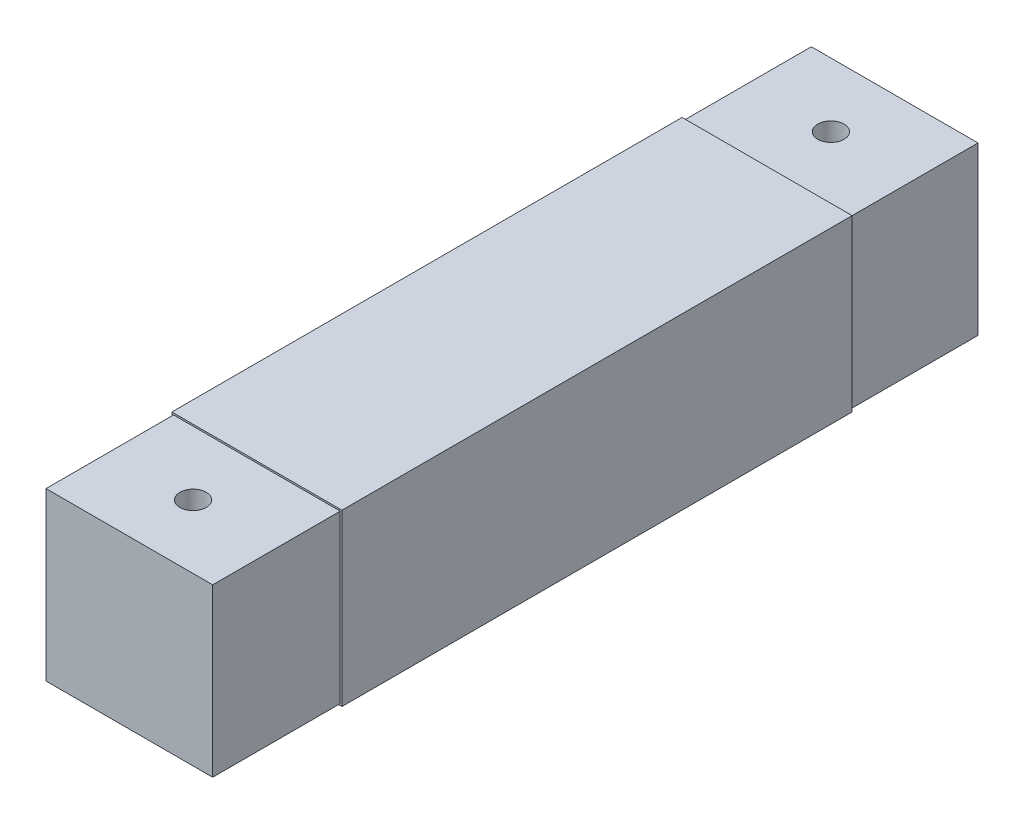
ISO-10303-21;
HEADER;
FILE_DESCRIPTION(('STEP AP214'),'2;1');
FILE_NAME('part.step','',(''),(''),'','','');
FILE_SCHEMA(('AUTOMOTIVE_DESIGN { 1 0 10303 214 1 1 1 1 }'));
ENDSEC;
DATA;
#1=APPLICATION_CONTEXT('core data for automotive mechanical design processes');
#2=APPLICATION_PROTOCOL_DEFINITION('international standard','automotive_design',2000,#1);
#3=PRODUCT_CONTEXT('',#1,'mechanical');
#4=PRODUCT('Part','Part','',(#3));
#5=PRODUCT_RELATED_PRODUCT_CATEGORY('part','',(#4));
#6=PRODUCT_DEFINITION_FORMATION('','',#4);
#7=PRODUCT_DEFINITION_CONTEXT('part definition',#1,'design');
#8=PRODUCT_DEFINITION('design','',#6,#7);
#9=PRODUCT_DEFINITION_SHAPE('','',#8);
#10=(LENGTH_UNIT() NAMED_UNIT(*) SI_UNIT(.MILLI.,.METRE.));
#11=(NAMED_UNIT(*) PLANE_ANGLE_UNIT() SI_UNIT($,.RADIAN.));
#12=(NAMED_UNIT(*) SI_UNIT($,.STERADIAN.) SOLID_ANGLE_UNIT());
#13=UNCERTAINTY_MEASURE_WITH_UNIT(LENGTH_MEASURE(1.E-05),#10,'distance_accuracy_value','');
#14=(GEOMETRIC_REPRESENTATION_CONTEXT(3) GLOBAL_UNCERTAINTY_ASSIGNED_CONTEXT((#13)) GLOBAL_UNIT_ASSIGNED_CONTEXT((#10,
#11,#12)) REPRESENTATION_CONTEXT('',''));
#15=CARTESIAN_POINT('',(0.,0.,0.));
#16=DIRECTION('',(0.,0.,1.));
#17=DIRECTION('',(1.,0.,0.));
#18=AXIS2_PLACEMENT_3D('',#15,#16,#17);
#19=CARTESIAN_POINT('',(0.,20.,120.));
#20=DIRECTION('',(0.,1.,0.));
#21=DIRECTION('',(0.,0.,1.));
#22=AXIS2_PLACEMENT_3D('',#19,#20,#21);
#23=PLANE('',#22);
#24=DIRECTION('',(1.,0.,0.));
#25=VECTOR('',#24,1.);
#26=CARTESIAN_POINT('',(0.,20.,45.));
#27=LINE('',#26,#25);
#28=CARTESIAN_POINT('',(0.,20.,45.));
#29=VERTEX_POINT('',#28);
#30=CARTESIAN_POINT('',(20.,20.,45.));
#31=VERTEX_POINT('',#30);
#32=EDGE_CURVE('E68',#29,#31,#27,.T.);
#33=ORIENTED_EDGE('',*,*,#32,.F.);
#34=DIRECTION('',(0.,0.,-1.));
#35=VECTOR('',#34,1.);
#36=CARTESIAN_POINT('',(0.,20.,120.));
#37=LINE('',#36,#35);
#38=CARTESIAN_POINT('',(0.,20.,105.));
#39=VERTEX_POINT('',#38);
#40=EDGE_CURVE('E12',#39,#29,#37,.T.);
#41=ORIENTED_EDGE('',*,*,#40,.F.);
#42=DIRECTION('',(-1.,0.,0.));
#43=VECTOR('',#42,1.);
#44=CARTESIAN_POINT('',(0.,20.,105.));
#45=LINE('',#44,#43);
#46=CARTESIAN_POINT('',(20.,20.,105.));
#47=VERTEX_POINT('',#46);
#48=EDGE_CURVE('E199',#47,#39,#45,.T.);
#49=ORIENTED_EDGE('',*,*,#48,.F.);
#50=DIRECTION('',(0.,0.,-1.));
#51=VECTOR('',#50,1.);
#52=CARTESIAN_POINT('',(20.,20.,120.));
#53=LINE('',#52,#51);
#54=EDGE_CURVE('E216',#47,#31,#53,.T.);
#55=ORIENTED_EDGE('',*,*,#54,.T.);
#56=EDGE_LOOP('',(#33,#41,#49,#55));
#57=FACE_BOUND('',#56,.T.);
#58=ADVANCED_FACE('F44',(#57),#23,.T.);
#59=CARTESIAN_POINT('',(0.,0.,120.));
#60=DIRECTION('',(-1.,0.,0.));
#61=DIRECTION('',(0.,0.,1.));
#62=AXIS2_PLACEMENT_3D('',#59,#60,#61);
#63=PLANE('',#62);
#64=DIRECTION('',(0.,1.,0.));
#65=VECTOR('',#64,1.);
#66=CARTESIAN_POINT('',(0.,0.,45.));
#67=LINE('',#66,#65);
#68=CARTESIAN_POINT('',(0.,0.,45.));
#69=VERTEX_POINT('',#68);
#70=EDGE_CURVE('E179',#69,#29,#67,.T.);
#71=ORIENTED_EDGE('',*,*,#70,.F.);
#72=DIRECTION('',(0.,0.,-1.));
#73=VECTOR('',#72,1.);
#74=CARTESIAN_POINT('',(0.,0.,120.));
#75=LINE('',#74,#73);
#76=CARTESIAN_POINT('',(0.,0.,105.));
#77=VERTEX_POINT('',#76);
#78=EDGE_CURVE('E52',#77,#69,#75,.T.);
#79=ORIENTED_EDGE('',*,*,#78,.F.);
#80=DIRECTION('',(0.,-1.,0.));
#81=VECTOR('',#80,1.);
#82=CARTESIAN_POINT('',(0.,0.,105.));
#83=LINE('',#82,#81);
#84=EDGE_CURVE('E201',#39,#77,#83,.T.);
#85=ORIENTED_EDGE('',*,*,#84,.F.);
#86=ORIENTED_EDGE('',*,*,#40,.T.);
#87=EDGE_LOOP('',(#71,#79,#85,#86));
#88=FACE_BOUND('',#87,.T.);
#89=ADVANCED_FACE('F261',(#88),#63,.T.);
#90=CARTESIAN_POINT('',(0.,0.,120.));
#91=DIRECTION('',(0.,1.,0.));
#92=DIRECTION('',(0.,0.,1.));
#93=AXIS2_PLACEMENT_3D('',#90,#91,#92);
#94=PLANE('',#93);
#95=ORIENTED_EDGE('',*,*,#78,.T.);
#96=DIRECTION('',(1.,0.,0.));
#97=VECTOR('',#96,1.);
#98=CARTESIAN_POINT('',(0.,0.,45.));
#99=LINE('',#98,#97);
#100=CARTESIAN_POINT('',(20.,0.,45.));
#101=VERTEX_POINT('',#100);
#102=EDGE_CURVE('E176',#69,#101,#99,.T.);
#103=ORIENTED_EDGE('',*,*,#102,.T.);
#104=DIRECTION('',(0.,0.,-1.));
#105=VECTOR('',#104,1.);
#106=CARTESIAN_POINT('',(20.,0.,120.));
#107=LINE('',#106,#105);
#108=CARTESIAN_POINT('',(20.,0.,105.));
#109=VERTEX_POINT('',#108);
#110=EDGE_CURVE('E225',#109,#101,#107,.T.);
#111=ORIENTED_EDGE('',*,*,#110,.F.);
#112=DIRECTION('',(1.,0.,0.));
#113=VECTOR('',#112,1.);
#114=CARTESIAN_POINT('',(0.,0.,105.));
#115=LINE('',#114,#113);
#116=EDGE_CURVE('E195',#77,#109,#115,.T.);
#117=ORIENTED_EDGE('',*,*,#116,.F.);
#118=EDGE_LOOP('',(#95,#103,#111,#117));
#119=FACE_BOUND('',#118,.T.);
#120=ADVANCED_FACE('F266',(#119),#94,.F.);
#121=CARTESIAN_POINT('',(20.,0.,120.));
#122=DIRECTION('',(-1.,0.,0.));
#123=DIRECTION('',(0.,0.,1.));
#124=AXIS2_PLACEMENT_3D('',#121,#122,#123);
#125=PLANE('',#124);
#126=ORIENTED_EDGE('',*,*,#110,.T.);
#127=DIRECTION('',(0.,1.,0.));
#128=VECTOR('',#127,1.);
#129=CARTESIAN_POINT('',(20.,0.,45.));
#130=LINE('',#129,#128);
#131=EDGE_CURVE('E181',#101,#31,#130,.T.);
#132=ORIENTED_EDGE('',*,*,#131,.T.);
#133=ORIENTED_EDGE('',*,*,#54,.F.);
#134=DIRECTION('',(0.,1.,0.));
#135=VECTOR('',#134,1.);
#136=CARTESIAN_POINT('',(20.,0.,105.));
#137=LINE('',#136,#135);
#138=EDGE_CURVE('E197',#109,#47,#137,.T.);
#139=ORIENTED_EDGE('',*,*,#138,.F.);
#140=EDGE_LOOP('',(#126,#132,#133,#139));
#141=FACE_BOUND('',#140,.T.);
#142=ADVANCED_FACE('F282',(#141),#125,.F.);
#143=CARTESIAN_POINT('',(19.8,0.,105.));
#144=DIRECTION('',(1.,0.,0.));
#145=DIRECTION('',(0.,0.,-1.));
#146=AXIS2_PLACEMENT_3D('',#143,#144,#145);
#147=PLANE('',#146);
#148=DIRECTION('',(0.,1.,0.));
#149=VECTOR('',#148,1.);
#150=CARTESIAN_POINT('',(19.8,0.,120.));
#151=LINE('',#150,#149);
#152=CARTESIAN_POINT('',(19.8,0.2,120.));
#153=VERTEX_POINT('',#152);
#154=CARTESIAN_POINT('',(19.8,19.8,120.));
#155=VERTEX_POINT('',#154);
#156=EDGE_CURVE('E183',#153,#155,#151,.T.);
#157=ORIENTED_EDGE('',*,*,#156,.F.);
#158=DIRECTION('',(0.,0.,1.));
#159=VECTOR('',#158,1.);
#160=CARTESIAN_POINT('',(19.8,0.2,105.));
#161=LINE('',#160,#159);
#162=CARTESIAN_POINT('',(19.8,0.2,105.));
#163=VERTEX_POINT('',#162);
#164=EDGE_CURVE('E203',#163,#153,#161,.T.);
#165=ORIENTED_EDGE('',*,*,#164,.F.);
#166=DIRECTION('',(0.,1.,0.));
#167=VECTOR('',#166,1.);
#168=CARTESIAN_POINT('',(19.8,0.,105.));
#169=LINE('',#168,#167);
#170=CARTESIAN_POINT('',(19.8,19.8,105.));
#171=VERTEX_POINT('',#170);
#172=EDGE_CURVE('E185',#163,#171,#169,.T.);
#173=ORIENTED_EDGE('',*,*,#172,.T.);
#174=DIRECTION('',(0.,0.,1.));
#175=VECTOR('',#174,1.);
#176=CARTESIAN_POINT('',(19.8,19.8,105.));
#177=LINE('',#176,#175);
#178=EDGE_CURVE('E214',#171,#155,#177,.T.);
#179=ORIENTED_EDGE('',*,*,#178,.T.);
#180=EDGE_LOOP('',(#157,#165,#173,#179));
#181=FACE_BOUND('',#180,.T.);
#182=ADVANCED_FACE('F284',(#181),#147,.T.);
#183=CARTESIAN_POINT('',(0.,19.8,105.));
#184=DIRECTION('',(0.,-1.,0.));
#185=DIRECTION('',(0.,0.,-1.));
#186=AXIS2_PLACEMENT_3D('',#183,#184,#185);
#187=PLANE('',#186);
#188=CARTESIAN_POINT('',(9.99757350109527,19.8,112.5));
#189=DIRECTION('',(0.,1.,0.));
#190=DIRECTION('',(0.,0.,1.));
#191=AXIS2_PLACEMENT_3D('',#188,#189,#190);
#192=CIRCLE('',#191,1.55);
#193=CARTESIAN_POINT('',(9.99757350109527,19.8,114.05));
#194=VERTEX_POINT('',#193);
#195=EDGE_CURVE('E163',#194,#194,#192,.T.);
#196=ORIENTED_EDGE('',*,*,#195,.F.);
#197=EDGE_LOOP('',(#196));
#198=FACE_BOUND('',#197,.T.);
#199=DIRECTION('',(1.,0.,0.));
#200=VECTOR('',#199,1.);
#201=CARTESIAN_POINT('',(0.,19.8,120.));
#202=LINE('',#201,#200);
#203=CARTESIAN_POINT('',(0.2,19.8,120.));
#204=VERTEX_POINT('',#203);
#205=EDGE_CURVE('E188',#204,#155,#202,.T.);
#206=ORIENTED_EDGE('',*,*,#205,.T.);
#207=ORIENTED_EDGE('',*,*,#178,.F.);
#208=DIRECTION('',(1.,0.,0.));
#209=VECTOR('',#208,1.);
#210=CARTESIAN_POINT('',(0.,19.8,105.));
#211=LINE('',#210,#209);
#212=CARTESIAN_POINT('',(0.2,19.8,105.));
#213=VERTEX_POINT('',#212);
#214=EDGE_CURVE('E192',#213,#171,#211,.T.);
#215=ORIENTED_EDGE('',*,*,#214,.F.);
#216=DIRECTION('',(0.,0.,1.));
#217=VECTOR('',#216,1.);
#218=CARTESIAN_POINT('',(0.2,19.8,105.));
#219=LINE('',#218,#217);
#220=EDGE_CURVE('E217',#213,#204,#219,.T.);
#221=ORIENTED_EDGE('',*,*,#220,.T.);
#222=EDGE_LOOP('',(#206,#207,#215,#221));
#223=FACE_BOUND('',#222,.T.);
#224=ADVANCED_FACE('F289',(#198,#223),#187,.F.);
#225=CARTESIAN_POINT('',(0.2,0.,105.));
#226=DIRECTION('',(-1.,0.,0.));
#227=DIRECTION('',(0.,0.,1.));
#228=AXIS2_PLACEMENT_3D('',#225,#226,#227);
#229=PLANE('',#228);
#230=DIRECTION('',(0.,-1.,0.));
#231=VECTOR('',#230,1.);
#232=CARTESIAN_POINT('',(0.2,0.,120.));
#233=LINE('',#232,#231);
#234=CARTESIAN_POINT('',(0.2,0.2,120.));
#235=VERTEX_POINT('',#234);
#236=EDGE_CURVE('E209',#204,#235,#233,.T.);
#237=ORIENTED_EDGE('',*,*,#236,.F.);
#238=ORIENTED_EDGE('',*,*,#220,.F.);
#239=DIRECTION('',(0.,-1.,0.));
#240=VECTOR('',#239,1.);
#241=CARTESIAN_POINT('',(0.2,0.,105.));
#242=LINE('',#241,#240);
#243=CARTESIAN_POINT('',(0.2,0.2,105.));
#244=VERTEX_POINT('',#243);
#245=EDGE_CURVE('E190',#213,#244,#242,.T.);
#246=ORIENTED_EDGE('',*,*,#245,.T.);
#247=DIRECTION('',(0.,0.,1.));
#248=VECTOR('',#247,1.);
#249=CARTESIAN_POINT('',(0.2,0.2,105.));
#250=LINE('',#249,#248);
#251=EDGE_CURVE('E219',#244,#235,#250,.T.);
#252=ORIENTED_EDGE('',*,*,#251,.T.);
#253=EDGE_LOOP('',(#237,#238,#246,#252));
#254=FACE_BOUND('',#253,.T.);
#255=ADVANCED_FACE('F300',(#254),#229,.T.);
#256=CARTESIAN_POINT('',(0.,0.2,105.));
#257=DIRECTION('',(0.,-1.,0.));
#258=DIRECTION('',(0.,0.,-1.));
#259=AXIS2_PLACEMENT_3D('',#256,#257,#258);
#260=PLANE('',#259);
#261=CARTESIAN_POINT('',(9.99757350109527,0.2,112.5));
#262=DIRECTION('',(0.,-1.,0.));
#263=DIRECTION('',(0.,0.,-1.));
#264=AXIS2_PLACEMENT_3D('',#261,#262,#263);
#265=CIRCLE('',#264,1.55);
#266=CARTESIAN_POINT('',(9.99757350109527,0.2,110.95));
#267=VERTEX_POINT('',#266);
#268=EDGE_CURVE('E169',#267,#267,#265,.T.);
#269=ORIENTED_EDGE('',*,*,#268,.F.);
#270=EDGE_LOOP('',(#269));
#271=FACE_BOUND('',#270,.T.);
#272=DIRECTION('',(1.,0.,0.));
#273=VECTOR('',#272,1.);
#274=CARTESIAN_POINT('',(0.,0.2,120.));
#275=LINE('',#274,#273);
#276=EDGE_CURVE('E206',#235,#153,#275,.T.);
#277=ORIENTED_EDGE('',*,*,#276,.F.);
#278=ORIENTED_EDGE('',*,*,#251,.F.);
#279=DIRECTION('',(1.,0.,0.));
#280=VECTOR('',#279,1.);
#281=CARTESIAN_POINT('',(0.,0.2,105.));
#282=LINE('',#281,#280);
#283=EDGE_CURVE('E187',#244,#163,#282,.T.);
#284=ORIENTED_EDGE('',*,*,#283,.T.);
#285=ORIENTED_EDGE('',*,*,#164,.T.);
#286=EDGE_LOOP('',(#277,#278,#284,#285));
#287=FACE_BOUND('',#286,.T.);
#288=ADVANCED_FACE('F297',(#271,#287),#260,.T.);
#289=CARTESIAN_POINT('',(0.,0.,105.));
#290=DIRECTION('',(0.,0.,1.));
#291=DIRECTION('',(1.,0.,0.));
#292=AXIS2_PLACEMENT_3D('',#289,#290,#291);
#293=PLANE('',#292);
#294=ORIENTED_EDGE('',*,*,#172,.F.);
#295=ORIENTED_EDGE('',*,*,#283,.F.);
#296=ORIENTED_EDGE('',*,*,#245,.F.);
#297=ORIENTED_EDGE('',*,*,#214,.T.);
#298=EDGE_LOOP('',(#294,#295,#296,#297));
#299=FACE_BOUND('',#298,.T.);
#300=ORIENTED_EDGE('',*,*,#116,.T.);
#301=ORIENTED_EDGE('',*,*,#138,.T.);
#302=ORIENTED_EDGE('',*,*,#48,.T.);
#303=ORIENTED_EDGE('',*,*,#84,.T.);
#304=EDGE_LOOP('',(#300,#301,#302,#303));
#305=FACE_BOUND('',#304,.T.);
#306=ADVANCED_FACE('F277',(#299,#305),#293,.T.);
#307=CARTESIAN_POINT('',(0.,0.,120.));
#308=DIRECTION('',(0.,0.,1.));
#309=DIRECTION('',(1.,0.,0.));
#310=AXIS2_PLACEMENT_3D('',#307,#308,#309);
#311=PLANE('',#310);
#312=ORIENTED_EDGE('',*,*,#276,.T.);
#313=ORIENTED_EDGE('',*,*,#156,.T.);
#314=ORIENTED_EDGE('',*,*,#205,.F.);
#315=ORIENTED_EDGE('',*,*,#236,.T.);
#316=EDGE_LOOP('',(#312,#313,#314,#315));
#317=FACE_BOUND('',#316,.T.);
#318=ADVANCED_FACE('F256',(#317),#311,.T.);
#319=CARTESIAN_POINT('',(0.,0.,45.));
#320=DIRECTION('',(0.,0.,1.));
#321=DIRECTION('',(1.,0.,0.));
#322=AXIS2_PLACEMENT_3D('',#319,#320,#321);
#323=PLANE('',#322);
#324=DIRECTION('',(0.,1.,0.));
#325=VECTOR('',#324,1.);
#326=CARTESIAN_POINT('',(19.8,0.2,45.));
#327=LINE('',#326,#325);
#328=CARTESIAN_POINT('',(19.8,0.2,45.));
#329=VERTEX_POINT('',#328);
#330=CARTESIAN_POINT('',(19.8,19.8,45.));
#331=VERTEX_POINT('',#330);
#332=EDGE_CURVE('E157',#329,#331,#327,.T.);
#333=ORIENTED_EDGE('',*,*,#332,.T.);
#334=DIRECTION('',(-1.,0.,0.));
#335=VECTOR('',#334,1.);
#336=CARTESIAN_POINT('',(19.8,19.8,45.));
#337=LINE('',#336,#335);
#338=CARTESIAN_POINT('',(0.2,19.8,45.));
#339=VERTEX_POINT('',#338);
#340=EDGE_CURVE('E60',#331,#339,#337,.T.);
#341=ORIENTED_EDGE('',*,*,#340,.T.);
#342=DIRECTION('',(0.,1.,0.));
#343=VECTOR('',#342,1.);
#344=CARTESIAN_POINT('',(0.2,0.2,45.));
#345=LINE('',#344,#343);
#346=CARTESIAN_POINT('',(0.2,0.2,45.));
#347=VERTEX_POINT('',#346);
#348=EDGE_CURVE('E151',#347,#339,#345,.T.);
#349=ORIENTED_EDGE('',*,*,#348,.F.);
#350=DIRECTION('',(-1.,0.,0.));
#351=VECTOR('',#350,1.);
#352=CARTESIAN_POINT('',(19.8,0.2,45.));
#353=LINE('',#352,#351);
#354=EDGE_CURVE('E160',#329,#347,#353,.T.);
#355=ORIENTED_EDGE('',*,*,#354,.F.);
#356=EDGE_LOOP('',(#333,#341,#349,#355));
#357=FACE_BOUND('',#356,.T.);
#358=ORIENTED_EDGE('',*,*,#32,.T.);
#359=ORIENTED_EDGE('',*,*,#131,.F.);
#360=ORIENTED_EDGE('',*,*,#102,.F.);
#361=ORIENTED_EDGE('',*,*,#70,.T.);
#362=EDGE_LOOP('',(#358,#359,#360,#361));
#363=FACE_BOUND('',#362,.T.);
#364=ADVANCED_FACE('F247',(#357,#363),#323,.F.);
#365=CARTESIAN_POINT('',(19.8,19.8,30.));
#366=DIRECTION('',(0.,1.,0.));
#367=DIRECTION('',(0.,0.,1.));
#368=AXIS2_PLACEMENT_3D('',#365,#366,#367);
#369=PLANE('',#368);
#370=CARTESIAN_POINT('',(10.,19.8,37.5));
#371=DIRECTION('',(0.,1.,0.));
#372=DIRECTION('',(0.,0.,1.));
#373=AXIS2_PLACEMENT_3D('',#370,#371,#372);
#374=CIRCLE('',#373,1.55);
#375=CARTESIAN_POINT('',(10.,19.8,39.05));
#376=VERTEX_POINT('',#375);
#377=EDGE_CURVE('E236',#376,#376,#374,.T.);
#378=ORIENTED_EDGE('',*,*,#377,.F.);
#379=EDGE_LOOP('',(#378));
#380=FACE_BOUND('',#379,.T.);
#381=ORIENTED_EDGE('',*,*,#340,.F.);
#382=DIRECTION('',(0.,0.,1.));
#383=VECTOR('',#382,1.);
#384=CARTESIAN_POINT('',(19.8,19.8,30.));
#385=LINE('',#384,#383);
#386=CARTESIAN_POINT('',(19.8,19.8,30.));
#387=VERTEX_POINT('',#386);
#388=EDGE_CURVE('E156',#387,#331,#385,.T.);
#389=ORIENTED_EDGE('',*,*,#388,.F.);
#390=DIRECTION('',(-1.,0.,0.));
#391=VECTOR('',#390,1.);
#392=CARTESIAN_POINT('',(19.8,19.8,30.));
#393=LINE('',#392,#391);
#394=CARTESIAN_POINT('',(0.2,19.8,30.));
#395=VERTEX_POINT('',#394);
#396=EDGE_CURVE('E139',#387,#395,#393,.T.);
#397=ORIENTED_EDGE('',*,*,#396,.T.);
#398=DIRECTION('',(0.,0.,1.));
#399=VECTOR('',#398,1.);
#400=CARTESIAN_POINT('',(0.2,19.8,30.));
#401=LINE('',#400,#399);
#402=EDGE_CURVE('E148',#395,#339,#401,.T.);
#403=ORIENTED_EDGE('',*,*,#402,.T.);
#404=EDGE_LOOP('',(#381,#389,#397,#403));
#405=FACE_BOUND('',#404,.T.);
#406=ADVANCED_FACE('F155',(#380,#405),#369,.T.);
#407=CARTESIAN_POINT('',(19.8,0.2,30.));
#408=DIRECTION('',(1.,0.,0.));
#409=DIRECTION('',(0.,0.,-1.));
#410=AXIS2_PLACEMENT_3D('',#407,#408,#409);
#411=PLANE('',#410);
#412=ORIENTED_EDGE('',*,*,#332,.F.);
#413=DIRECTION('',(0.,0.,1.));
#414=VECTOR('',#413,1.);
#415=CARTESIAN_POINT('',(19.8,0.2,30.));
#416=LINE('',#415,#414);
#417=CARTESIAN_POINT('',(19.8,0.2,30.));
#418=VERTEX_POINT('',#417);
#419=EDGE_CURVE('E173',#418,#329,#416,.T.);
#420=ORIENTED_EDGE('',*,*,#419,.F.);
#421=DIRECTION('',(0.,1.,0.));
#422=VECTOR('',#421,1.);
#423=CARTESIAN_POINT('',(19.8,0.2,30.));
#424=LINE('',#423,#422);
#425=EDGE_CURVE('E153',#418,#387,#424,.T.);
#426=ORIENTED_EDGE('',*,*,#425,.T.);
#427=ORIENTED_EDGE('',*,*,#388,.T.);
#428=EDGE_LOOP('',(#412,#420,#426,#427));
#429=FACE_BOUND('',#428,.T.);
#430=ADVANCED_FACE('F246',(#429),#411,.T.);
#431=CARTESIAN_POINT('',(19.8,0.2,30.));
#432=DIRECTION('',(0.,1.,0.));
#433=DIRECTION('',(0.,0.,1.));
#434=AXIS2_PLACEMENT_3D('',#431,#432,#433);
#435=PLANE('',#434);
#436=CARTESIAN_POINT('',(10.,0.2,37.5));
#437=DIRECTION('',(0.,1.,0.));
#438=DIRECTION('',(0.,0.,1.));
#439=AXIS2_PLACEMENT_3D('',#436,#437,#438);
#440=CIRCLE('',#439,1.55);
#441=CARTESIAN_POINT('',(10.,0.2,39.05));
#442=VERTEX_POINT('',#441);
#443=EDGE_CURVE('E47',#442,#442,#440,.T.);
#444=ORIENTED_EDGE('',*,*,#443,.T.);
#445=EDGE_LOOP('',(#444));
#446=FACE_BOUND('',#445,.T.);
#447=ORIENTED_EDGE('',*,*,#354,.T.);
#448=DIRECTION('',(0.,0.,1.));
#449=VECTOR('',#448,1.);
#450=CARTESIAN_POINT('',(0.2,0.2,30.));
#451=LINE('',#450,#449);
#452=CARTESIAN_POINT('',(0.2,0.2,30.));
#453=VERTEX_POINT('',#452);
#454=EDGE_CURVE('E152',#453,#347,#451,.T.);
#455=ORIENTED_EDGE('',*,*,#454,.F.);
#456=DIRECTION('',(-1.,0.,0.));
#457=VECTOR('',#456,1.);
#458=CARTESIAN_POINT('',(19.8,0.2,30.));
#459=LINE('',#458,#457);
#460=EDGE_CURVE('E142',#418,#453,#459,.T.);
#461=ORIENTED_EDGE('',*,*,#460,.F.);
#462=ORIENTED_EDGE('',*,*,#419,.T.);
#463=EDGE_LOOP('',(#447,#455,#461,#462));
#464=FACE_BOUND('',#463,.T.);
#465=ADVANCED_FACE('F253',(#446,#464),#435,.F.);
#466=CARTESIAN_POINT('',(0.2,0.2,30.));
#467=DIRECTION('',(1.,0.,0.));
#468=DIRECTION('',(0.,0.,-1.));
#469=AXIS2_PLACEMENT_3D('',#466,#467,#468);
#470=PLANE('',#469);
#471=ORIENTED_EDGE('',*,*,#348,.T.);
#472=ORIENTED_EDGE('',*,*,#402,.F.);
#473=DIRECTION('',(0.,1.,0.));
#474=VECTOR('',#473,1.);
#475=CARTESIAN_POINT('',(0.2,0.2,30.));
#476=LINE('',#475,#474);
#477=EDGE_CURVE('E134',#453,#395,#476,.T.);
#478=ORIENTED_EDGE('',*,*,#477,.F.);
#479=ORIENTED_EDGE('',*,*,#454,.T.);
#480=EDGE_LOOP('',(#471,#472,#478,#479));
#481=FACE_BOUND('',#480,.T.);
#482=ADVANCED_FACE('F149',(#481),#470,.F.);
#483=CARTESIAN_POINT('',(0.,0.,30.));
#484=DIRECTION('',(0.,0.,-1.));
#485=DIRECTION('',(-1.,0.,0.));
#486=AXIS2_PLACEMENT_3D('',#483,#484,#485);
#487=PLANE('',#486);
#488=ORIENTED_EDGE('',*,*,#396,.F.);
#489=ORIENTED_EDGE('',*,*,#425,.F.);
#490=ORIENTED_EDGE('',*,*,#460,.T.);
#491=ORIENTED_EDGE('',*,*,#477,.T.);
#492=EDGE_LOOP('',(#488,#489,#490,#491));
#493=FACE_BOUND('',#492,.T.);
#494=ADVANCED_FACE('F136',(#493),#487,.T.);
#495=CARTESIAN_POINT('',(9.99757350109527,-0.199999999999999,112.5));
#496=DIRECTION('',(0.,1.,0.));
#497=DIRECTION('',(0.,0.,1.));
#498=AXIS2_PLACEMENT_3D('',#495,#496,#497);
#499=CYLINDRICAL_SURFACE('',#498,1.55);
#500=ORIENTED_EDGE('',*,*,#268,.T.);
#501=EDGE_LOOP('',(#500));
#502=FACE_BOUND('',#501,.T.);
#503=ORIENTED_EDGE('',*,*,#195,.T.);
#504=EDGE_LOOP('',(#503));
#505=FACE_BOUND('',#504,.T.);
#506=ADVANCED_FACE('F363',(#502,#505),#499,.F.);
#507=CARTESIAN_POINT('',(10.,-0.199999999999999,37.5));
#508=DIRECTION('',(0.,1.,0.));
#509=DIRECTION('',(0.,0.,1.));
#510=AXIS2_PLACEMENT_3D('',#507,#508,#509);
#511=CYLINDRICAL_SURFACE('',#510,1.55);
#512=ORIENTED_EDGE('',*,*,#377,.T.);
#513=EDGE_LOOP('',(#512));
#514=FACE_BOUND('',#513,.T.);
#515=ORIENTED_EDGE('',*,*,#443,.F.);
#516=EDGE_LOOP('',(#515));
#517=FACE_BOUND('',#516,.T.);
#518=ADVANCED_FACE('F242',(#514,#517),#511,.F.);
#519=CLOSED_SHELL('',(#58,#89,#120,#142,#182,#224,#255,#288,#306,#318,#364,#406,#430,#465,#482,
#494,#506,#518));
#520=MANIFOLD_SOLID_BREP('B2',#519);
#521=ADVANCED_BREP_SHAPE_REPRESENTATION('',(#18,#520),#14);
#522=SHAPE_DEFINITION_REPRESENTATION(#9,#521);
ENDSEC;
END-ISO-10303-21;
